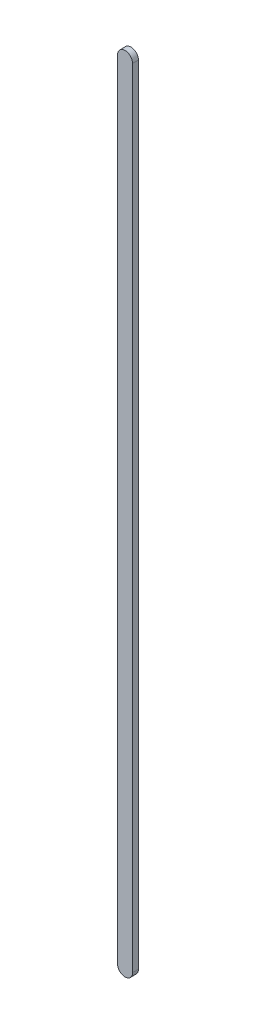
ISO-10303-21;
HEADER;
FILE_DESCRIPTION(('STEP AP214'),'2;1');
FILE_NAME('part.step','',(''),(''),'','','');
FILE_SCHEMA(('AUTOMOTIVE_DESIGN { 1 0 10303 214 1 1 1 1 }'));
ENDSEC;
DATA;
#1=APPLICATION_CONTEXT('core data for automotive mechanical design processes');
#2=APPLICATION_PROTOCOL_DEFINITION('international standard','automotive_design',2000,#1);
#3=PRODUCT_CONTEXT('',#1,'mechanical');
#4=PRODUCT('Part','Part','',(#3));
#5=PRODUCT_RELATED_PRODUCT_CATEGORY('part','',(#4));
#6=PRODUCT_DEFINITION_FORMATION('','',#4);
#7=PRODUCT_DEFINITION_CONTEXT('part definition',#1,'design');
#8=PRODUCT_DEFINITION('design','',#6,#7);
#9=PRODUCT_DEFINITION_SHAPE('','',#8);
#10=(LENGTH_UNIT() NAMED_UNIT(*) SI_UNIT(.MILLI.,.METRE.));
#11=(NAMED_UNIT(*) PLANE_ANGLE_UNIT() SI_UNIT($,.RADIAN.));
#12=(NAMED_UNIT(*) SI_UNIT($,.STERADIAN.) SOLID_ANGLE_UNIT());
#13=UNCERTAINTY_MEASURE_WITH_UNIT(LENGTH_MEASURE(1.E-05),#10,'distance_accuracy_value','');
#14=(GEOMETRIC_REPRESENTATION_CONTEXT(3) GLOBAL_UNCERTAINTY_ASSIGNED_CONTEXT((#13)) GLOBAL_UNIT_ASSIGNED_CONTEXT((#10,
#11,#12)) REPRESENTATION_CONTEXT('',''));
#15=CARTESIAN_POINT('',(0.,0.,0.));
#16=DIRECTION('',(0.,0.,1.));
#17=DIRECTION('',(1.,0.,0.));
#18=AXIS2_PLACEMENT_3D('',#15,#16,#17);
#19=CARTESIAN_POINT('',(105.9688,68.5546,0.));
#20=DIRECTION('',(-1.,0.,0.));
#21=DIRECTION('',(0.,1.,0.));
#22=AXIS2_PLACEMENT_3D('',#19,#20,#21);
#23=PLANE('',#22);
#24=DIRECTION('',(0.,1.,0.));
#25=VECTOR('',#24,1.);
#26=CARTESIAN_POINT('',(105.9688,68.5546,0.1999996));
#27=LINE('',#26,#25);
#28=CARTESIAN_POINT('',(105.9688,68.5546,0.1999996));
#29=VERTEX_POINT('',#28);
#30=CARTESIAN_POINT('',(105.9688,95.25,0.1999996));
#31=VERTEX_POINT('',#30);
#32=EDGE_CURVE('E11',#29,#31,#27,.T.);
#33=ORIENTED_EDGE('',*,*,#32,.F.);
#34=DIRECTION('',(0.,0.,1.));
#35=VECTOR('',#34,1.);
#36=CARTESIAN_POINT('',(105.9688,68.5546,0.));
#37=LINE('',#36,#35);
#38=CARTESIAN_POINT('',(105.9688,68.5546,0.));
#39=VERTEX_POINT('',#38);
#40=EDGE_CURVE('E24',#39,#29,#37,.T.);
#41=ORIENTED_EDGE('',*,*,#40,.F.);
#42=DIRECTION('',(0.,1.,0.));
#43=VECTOR('',#42,1.);
#44=CARTESIAN_POINT('',(105.9688,68.5546,0.));
#45=LINE('',#44,#43);
#46=CARTESIAN_POINT('',(105.9688,95.25,0.));
#47=VERTEX_POINT('',#46);
#48=EDGE_CURVE('E75',#39,#47,#45,.T.);
#49=ORIENTED_EDGE('',*,*,#48,.T.);
#50=DIRECTION('',(0.,0.,1.));
#51=VECTOR('',#50,1.);
#52=CARTESIAN_POINT('',(105.9688,95.25,0.));
#53=LINE('',#52,#51);
#54=EDGE_CURVE('E37',#47,#31,#53,.T.);
#55=ORIENTED_EDGE('',*,*,#54,.T.);
#56=EDGE_LOOP('',(#33,#41,#49,#55));
#57=FACE_BOUND('',#56,.T.);
#58=ADVANCED_FACE('F17',(#57),#23,.F.);
#59=CARTESIAN_POINT('',(105.7148,95.25,0.));
#60=DIRECTION('',(0.,0.,-1.));
#61=DIRECTION('',(1.,0.,0.));
#62=AXIS2_PLACEMENT_3D('',#59,#60,#61);
#63=CYLINDRICAL_SURFACE('',#62,0.253999999999995);
#64=CARTESIAN_POINT('',(105.7148,95.25,0.1999996));
#65=DIRECTION('',(0.,0.,1.));
#66=DIRECTION('',(1.,0.,0.));
#67=AXIS2_PLACEMENT_3D('',#64,#65,#66);
#68=CIRCLE('',#67,0.253999999999995);
#69=CARTESIAN_POINT('',(105.4608,95.25,0.1999996));
#70=VERTEX_POINT('',#69);
#71=EDGE_CURVE('E83',#31,#70,#68,.T.);
#72=ORIENTED_EDGE('',*,*,#71,.F.);
#73=ORIENTED_EDGE('',*,*,#54,.F.);
#74=CARTESIAN_POINT('',(105.7148,95.25,0.));
#75=DIRECTION('',(0.,0.,1.));
#76=DIRECTION('',(1.,0.,0.));
#77=AXIS2_PLACEMENT_3D('',#74,#75,#76);
#78=CIRCLE('',#77,0.253999999999995);
#79=CARTESIAN_POINT('',(105.4608,95.25,0.));
#80=VERTEX_POINT('',#79);
#81=EDGE_CURVE('E81',#47,#80,#78,.T.);
#82=ORIENTED_EDGE('',*,*,#81,.T.);
#83=DIRECTION('',(0.,0.,1.));
#84=VECTOR('',#83,1.);
#85=CARTESIAN_POINT('',(105.4608,95.25,0.));
#86=LINE('',#85,#84);
#87=EDGE_CURVE('E67',#80,#70,#86,.T.);
#88=ORIENTED_EDGE('',*,*,#87,.T.);
#89=EDGE_LOOP('',(#72,#73,#82,#88));
#90=FACE_BOUND('',#89,.T.);
#91=ADVANCED_FACE('F89',(#90),#63,.T.);
#92=CARTESIAN_POINT('',(105.4608,95.25,0.));
#93=DIRECTION('',(1.,0.,0.));
#94=DIRECTION('',(0.,-1.,0.));
#95=AXIS2_PLACEMENT_3D('',#92,#93,#94);
#96=PLANE('',#95);
#97=DIRECTION('',(0.,-1.,0.));
#98=VECTOR('',#97,1.);
#99=CARTESIAN_POINT('',(105.4608,95.25,0.1999996));
#100=LINE('',#99,#98);
#101=CARTESIAN_POINT('',(105.4608,68.5546,0.1999996));
#102=VERTEX_POINT('',#101);
#103=EDGE_CURVE('E71',#70,#102,#100,.T.);
#104=ORIENTED_EDGE('',*,*,#103,.F.);
#105=ORIENTED_EDGE('',*,*,#87,.F.);
#106=DIRECTION('',(0.,-1.,0.));
#107=VECTOR('',#106,1.);
#108=CARTESIAN_POINT('',(105.4608,95.25,0.));
#109=LINE('',#108,#107);
#110=CARTESIAN_POINT('',(105.4608,68.5546,0.));
#111=VERTEX_POINT('',#110);
#112=EDGE_CURVE('E63',#80,#111,#109,.T.);
#113=ORIENTED_EDGE('',*,*,#112,.T.);
#114=DIRECTION('',(0.,0.,1.));
#115=VECTOR('',#114,1.);
#116=CARTESIAN_POINT('',(105.4608,68.5546,0.));
#117=LINE('',#116,#115);
#118=EDGE_CURVE('E53',#111,#102,#117,.T.);
#119=ORIENTED_EDGE('',*,*,#118,.T.);
#120=EDGE_LOOP('',(#104,#105,#113,#119));
#121=FACE_BOUND('',#120,.T.);
#122=ADVANCED_FACE('F66',(#121),#96,.F.);
#123=CARTESIAN_POINT('',(105.7148,68.5546,0.));
#124=DIRECTION('',(0.,0.,-1.));
#125=DIRECTION('',(-1.,0.,0.));
#126=AXIS2_PLACEMENT_3D('',#123,#124,#125);
#127=CYLINDRICAL_SURFACE('',#126,0.254);
#128=CARTESIAN_POINT('',(105.7148,68.5546,0.1999996));
#129=DIRECTION('',(0.,0.,1.));
#130=DIRECTION('',(-1.,0.,0.));
#131=AXIS2_PLACEMENT_3D('',#128,#129,#130);
#132=CIRCLE('',#131,0.254);
#133=EDGE_CURVE('E59',#102,#29,#132,.T.);
#134=ORIENTED_EDGE('',*,*,#133,.F.);
#135=ORIENTED_EDGE('',*,*,#118,.F.);
#136=CARTESIAN_POINT('',(105.7148,68.5546,0.));
#137=DIRECTION('',(0.,0.,1.));
#138=DIRECTION('',(-1.,0.,0.));
#139=AXIS2_PLACEMENT_3D('',#136,#137,#138);
#140=CIRCLE('',#139,0.254);
#141=EDGE_CURVE('E57',#111,#39,#140,.T.);
#142=ORIENTED_EDGE('',*,*,#141,.T.);
#143=ORIENTED_EDGE('',*,*,#40,.T.);
#144=EDGE_LOOP('',(#134,#135,#142,#143));
#145=FACE_BOUND('',#144,.T.);
#146=ADVANCED_FACE('F55',(#145),#127,.T.);
#147=CARTESIAN_POINT('',(105.9688,68.5546,0.));
#148=DIRECTION('',(0.,0.,-1.));
#149=DIRECTION('',(-1.,0.,0.));
#150=AXIS2_PLACEMENT_3D('',#147,#148,#149);
#151=PLANE('',#150);
#152=ORIENTED_EDGE('',*,*,#141,.F.);
#153=ORIENTED_EDGE('',*,*,#112,.F.);
#154=ORIENTED_EDGE('',*,*,#81,.F.);
#155=ORIENTED_EDGE('',*,*,#48,.F.);
#156=EDGE_LOOP('',(#152,#153,#154,#155));
#157=FACE_BOUND('',#156,.T.);
#158=ADVANCED_FACE('F74',(#157),#151,.T.);
#159=CARTESIAN_POINT('',(105.9688,68.5546,0.1999996));
#160=DIRECTION('',(0.,0.,-1.));
#161=DIRECTION('',(-1.,0.,0.));
#162=AXIS2_PLACEMENT_3D('',#159,#160,#161);
#163=PLANE('',#162);
#164=ORIENTED_EDGE('',*,*,#32,.T.);
#165=ORIENTED_EDGE('',*,*,#71,.T.);
#166=ORIENTED_EDGE('',*,*,#103,.T.);
#167=ORIENTED_EDGE('',*,*,#133,.T.);
#168=EDGE_LOOP('',(#164,#165,#166,#167));
#169=FACE_BOUND('',#168,.T.);
#170=ADVANCED_FACE('F91',(#169),#163,.F.);
#171=CLOSED_SHELL('',(#58,#91,#122,#146,#158,#170));
#172=MANIFOLD_SOLID_BREP('B1',#171);
#173=ADVANCED_BREP_SHAPE_REPRESENTATION('',(#18,#172),#14);
#174=SHAPE_DEFINITION_REPRESENTATION(#9,#173);
ENDSEC;
END-ISO-10303-21;
